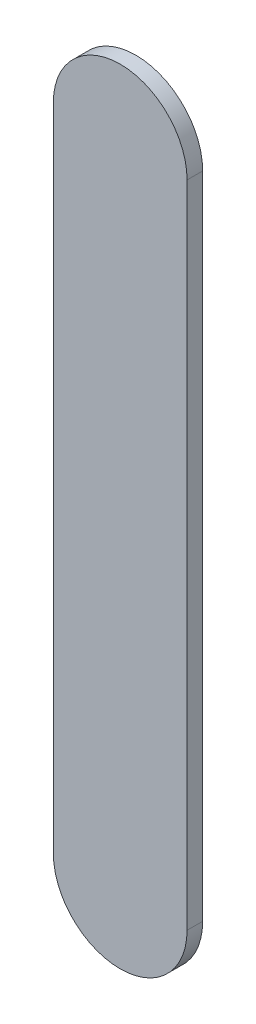
ISO-10303-21;
HEADER;
FILE_DESCRIPTION(('STEP AP214'),'2;1');
FILE_NAME('part.step','',(''),(''),'','','');
FILE_SCHEMA(('AUTOMOTIVE_DESIGN { 1 0 10303 214 1 1 1 1 }'));
ENDSEC;
DATA;
#1=APPLICATION_CONTEXT('core data for automotive mechanical design processes');
#2=APPLICATION_PROTOCOL_DEFINITION('international standard','automotive_design',2000,#1);
#3=PRODUCT_CONTEXT('',#1,'mechanical');
#4=PRODUCT('Part','Part','',(#3));
#5=PRODUCT_RELATED_PRODUCT_CATEGORY('part','',(#4));
#6=PRODUCT_DEFINITION_FORMATION('','',#4);
#7=PRODUCT_DEFINITION_CONTEXT('part definition',#1,'design');
#8=PRODUCT_DEFINITION('design','',#6,#7);
#9=PRODUCT_DEFINITION_SHAPE('','',#8);
#10=(LENGTH_UNIT() NAMED_UNIT(*) SI_UNIT(.MILLI.,.METRE.));
#11=(NAMED_UNIT(*) PLANE_ANGLE_UNIT() SI_UNIT($,.RADIAN.));
#12=(NAMED_UNIT(*) SI_UNIT($,.STERADIAN.) SOLID_ANGLE_UNIT());
#13=UNCERTAINTY_MEASURE_WITH_UNIT(LENGTH_MEASURE(1.E-05),#10,'distance_accuracy_value','');
#14=(GEOMETRIC_REPRESENTATION_CONTEXT(3) GLOBAL_UNCERTAINTY_ASSIGNED_CONTEXT((#13)) GLOBAL_UNIT_ASSIGNED_CONTEXT((#10,
#11,#12)) REPRESENTATION_CONTEXT('',''));
#15=CARTESIAN_POINT('',(0.,0.,0.));
#16=DIRECTION('',(0.,0.,1.));
#17=DIRECTION('',(1.,0.,0.));
#18=AXIS2_PLACEMENT_3D('',#15,#16,#17);
#19=CARTESIAN_POINT('',(125.65,-61.5875,1.635));
#20=DIRECTION('',(0.,0.,1.));
#21=DIRECTION('',(1.,0.,0.));
#22=AXIS2_PLACEMENT_3D('',#19,#20,#21);
#23=PLANE('',#22);
#24=DIRECTION('',(0.,1.,0.));
#25=VECTOR('',#24,1.);
#26=CARTESIAN_POINT('',(125.65,-61.5875,1.635));
#27=LINE('',#26,#25);
#28=CARTESIAN_POINT('',(125.65,-61.5875,1.635));
#29=VERTEX_POINT('',#28);
#30=CARTESIAN_POINT('',(125.65,-60.13,1.635));
#31=VERTEX_POINT('',#30);
#32=EDGE_CURVE('E83',#29,#31,#27,.T.);
#33=ORIENTED_EDGE('',*,*,#32,.T.);
#34=CARTESIAN_POINT('',(125.5,-60.13,1.635));
#35=DIRECTION('',(0.,0.,1.));
#36=DIRECTION('',(1.,0.,0.));
#37=AXIS2_PLACEMENT_3D('',#34,#35,#36);
#38=CIRCLE('',#37,0.15);
#39=CARTESIAN_POINT('',(125.35,-60.13,1.635));
#40=VERTEX_POINT('',#39);
#41=EDGE_CURVE('E107',#31,#40,#38,.T.);
#42=ORIENTED_EDGE('',*,*,#41,.T.);
#43=DIRECTION('',(0.,-1.,0.));
#44=VECTOR('',#43,1.);
#45=CARTESIAN_POINT('',(125.35,-60.13,1.635));
#46=LINE('',#45,#44);
#47=CARTESIAN_POINT('',(125.35,-61.5875,1.635));
#48=VERTEX_POINT('',#47);
#49=EDGE_CURVE('E20',#40,#48,#46,.T.);
#50=ORIENTED_EDGE('',*,*,#49,.T.);
#51=CARTESIAN_POINT('',(125.5,-61.5875,1.635));
#52=DIRECTION('',(0.,0.,1.));
#53=DIRECTION('',(-1.,0.,0.));
#54=AXIS2_PLACEMENT_3D('',#51,#52,#53);
#55=CIRCLE('',#54,0.15);
#56=EDGE_CURVE('E11',#48,#29,#55,.T.);
#57=ORIENTED_EDGE('',*,*,#56,.T.);
#58=EDGE_LOOP('',(#33,#42,#50,#57));
#59=FACE_BOUND('',#58,.T.);
#60=ADVANCED_FACE('F17',(#59),#23,.T.);
#61=CARTESIAN_POINT('',(125.65,-61.5875,1.6));
#62=DIRECTION('',(0.,0.,1.));
#63=DIRECTION('',(1.,0.,0.));
#64=AXIS2_PLACEMENT_3D('',#61,#62,#63);
#65=PLANE('',#64);
#66=CARTESIAN_POINT('',(125.5,-61.5875,1.6));
#67=DIRECTION('',(0.,0.,1.));
#68=DIRECTION('',(-1.,0.,0.));
#69=AXIS2_PLACEMENT_3D('',#66,#67,#68);
#70=CIRCLE('',#69,0.15);
#71=CARTESIAN_POINT('',(125.35,-61.5875,1.6));
#72=VERTEX_POINT('',#71);
#73=CARTESIAN_POINT('',(125.65,-61.5875,1.6));
#74=VERTEX_POINT('',#73);
#75=EDGE_CURVE('E26',#72,#74,#70,.T.);
#76=ORIENTED_EDGE('',*,*,#75,.F.);
#77=DIRECTION('',(0.,-1.,0.));
#78=VECTOR('',#77,1.);
#79=CARTESIAN_POINT('',(125.35,-60.13,1.6));
#80=LINE('',#79,#78);
#81=CARTESIAN_POINT('',(125.35,-60.13,1.6));
#82=VERTEX_POINT('',#81);
#83=EDGE_CURVE('E108',#82,#72,#80,.T.);
#84=ORIENTED_EDGE('',*,*,#83,.F.);
#85=CARTESIAN_POINT('',(125.5,-60.13,1.6));
#86=DIRECTION('',(0.,0.,1.));
#87=DIRECTION('',(1.,0.,0.));
#88=AXIS2_PLACEMENT_3D('',#85,#86,#87);
#89=CIRCLE('',#88,0.15);
#90=CARTESIAN_POINT('',(125.65,-60.13,1.6));
#91=VERTEX_POINT('',#90);
#92=EDGE_CURVE('E85',#91,#82,#89,.T.);
#93=ORIENTED_EDGE('',*,*,#92,.F.);
#94=DIRECTION('',(0.,1.,0.));
#95=VECTOR('',#94,1.);
#96=CARTESIAN_POINT('',(125.65,-61.5875,1.6));
#97=LINE('',#96,#95);
#98=EDGE_CURVE('E81',#74,#91,#97,.T.);
#99=ORIENTED_EDGE('',*,*,#98,.F.);
#100=EDGE_LOOP('',(#76,#84,#93,#99));
#101=FACE_BOUND('',#100,.T.);
#102=ADVANCED_FACE('F87',(#101),#65,.F.);
#103=CARTESIAN_POINT('',(125.5,-61.5875,1.6));
#104=DIRECTION('',(0.,0.,-1.));
#105=DIRECTION('',(-1.,0.,0.));
#106=AXIS2_PLACEMENT_3D('',#103,#104,#105);
#107=CYLINDRICAL_SURFACE('',#106,0.15);
#108=ORIENTED_EDGE('',*,*,#75,.T.);
#109=DIRECTION('',(0.,0.,1.));
#110=VECTOR('',#109,1.);
#111=CARTESIAN_POINT('',(125.65,-61.5875,1.6));
#112=LINE('',#111,#110);
#113=EDGE_CURVE('E70',#74,#29,#112,.T.);
#114=ORIENTED_EDGE('',*,*,#113,.T.);
#115=ORIENTED_EDGE('',*,*,#56,.F.);
#116=DIRECTION('',(0.,0.,1.));
#117=VECTOR('',#116,1.);
#118=CARTESIAN_POINT('',(125.35,-61.5875,1.6));
#119=LINE('',#118,#117);
#120=EDGE_CURVE('E73',#72,#48,#119,.T.);
#121=ORIENTED_EDGE('',*,*,#120,.F.);
#122=EDGE_LOOP('',(#108,#114,#115,#121));
#123=FACE_BOUND('',#122,.T.);
#124=ADVANCED_FACE('F69',(#123),#107,.T.);
#125=CARTESIAN_POINT('',(125.35,-60.13,1.6));
#126=DIRECTION('',(1.,0.,0.));
#127=DIRECTION('',(0.,1.,0.));
#128=AXIS2_PLACEMENT_3D('',#125,#126,#127);
#129=PLANE('',#128);
#130=ORIENTED_EDGE('',*,*,#83,.T.);
#131=ORIENTED_EDGE('',*,*,#120,.T.);
#132=ORIENTED_EDGE('',*,*,#49,.F.);
#133=DIRECTION('',(0.,0.,1.));
#134=VECTOR('',#133,1.);
#135=CARTESIAN_POINT('',(125.35,-60.13,1.6));
#136=LINE('',#135,#134);
#137=EDGE_CURVE('E100',#82,#40,#136,.T.);
#138=ORIENTED_EDGE('',*,*,#137,.F.);
#139=EDGE_LOOP('',(#130,#131,#132,#138));
#140=FACE_BOUND('',#139,.T.);
#141=ADVANCED_FACE('F122',(#140),#129,.F.);
#142=CARTESIAN_POINT('',(125.5,-60.13,1.6));
#143=DIRECTION('',(0.,0.,-1.));
#144=DIRECTION('',(1.,0.,0.));
#145=AXIS2_PLACEMENT_3D('',#142,#143,#144);
#146=CYLINDRICAL_SURFACE('',#145,0.15);
#147=ORIENTED_EDGE('',*,*,#92,.T.);
#148=ORIENTED_EDGE('',*,*,#137,.T.);
#149=ORIENTED_EDGE('',*,*,#41,.F.);
#150=DIRECTION('',(0.,0.,1.));
#151=VECTOR('',#150,1.);
#152=CARTESIAN_POINT('',(125.65,-60.13,1.6));
#153=LINE('',#152,#151);
#154=EDGE_CURVE('E91',#91,#31,#153,.T.);
#155=ORIENTED_EDGE('',*,*,#154,.F.);
#156=EDGE_LOOP('',(#147,#148,#149,#155));
#157=FACE_BOUND('',#156,.T.);
#158=ADVANCED_FACE('F124',(#157),#146,.T.);
#159=CARTESIAN_POINT('',(125.65,-61.5875,1.6));
#160=DIRECTION('',(-1.,0.,0.));
#161=DIRECTION('',(0.,0.,1.));
#162=AXIS2_PLACEMENT_3D('',#159,#160,#161);
#163=PLANE('',#162);
#164=ORIENTED_EDGE('',*,*,#98,.T.);
#165=ORIENTED_EDGE('',*,*,#154,.T.);
#166=ORIENTED_EDGE('',*,*,#32,.F.);
#167=ORIENTED_EDGE('',*,*,#113,.F.);
#168=EDGE_LOOP('',(#164,#165,#166,#167));
#169=FACE_BOUND('',#168,.T.);
#170=ADVANCED_FACE('F79',(#169),#163,.F.);
#171=CLOSED_SHELL('',(#60,#102,#124,#141,#158,#170));
#172=MANIFOLD_SOLID_BREP('B1',#171);
#173=ADVANCED_BREP_SHAPE_REPRESENTATION('',(#18,#172),#14);
#174=SHAPE_DEFINITION_REPRESENTATION(#9,#173);
ENDSEC;
END-ISO-10303-21;
